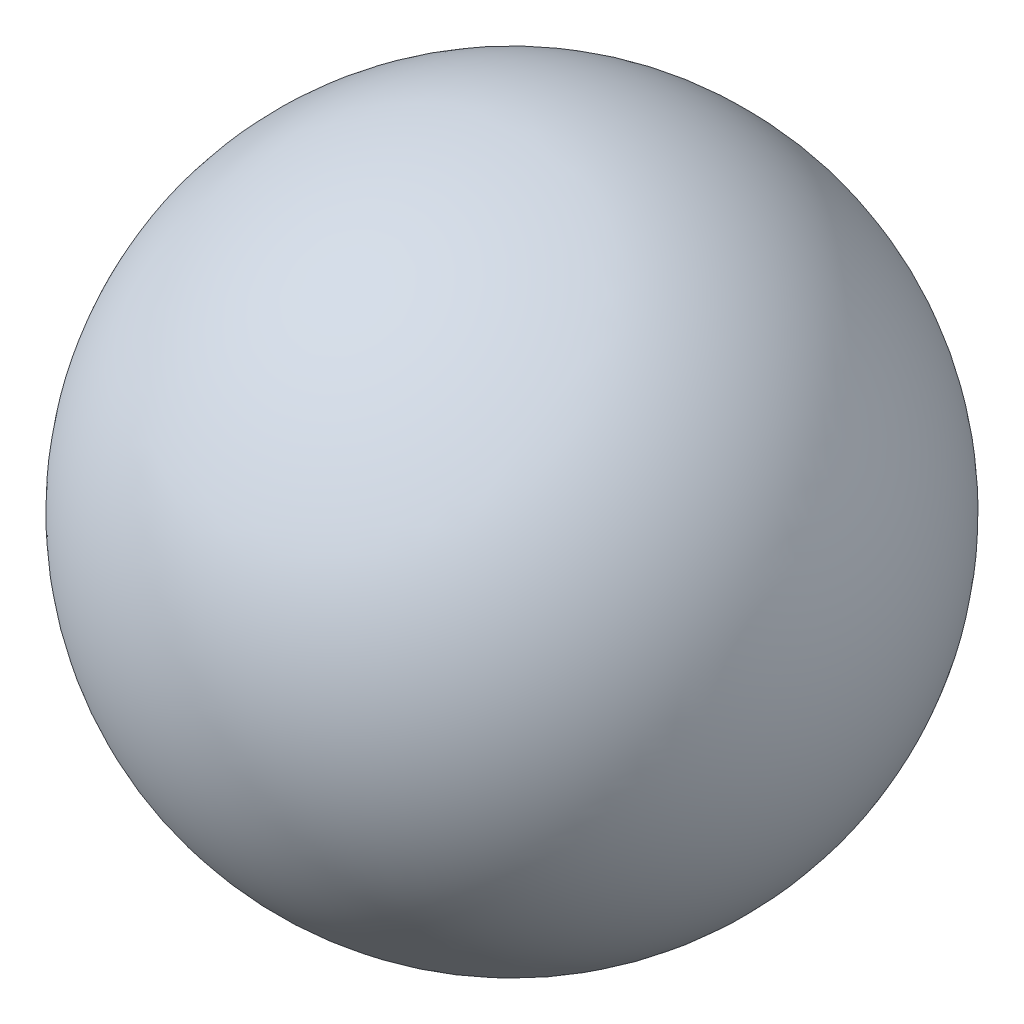
ISO-10303-21;
HEADER;
FILE_DESCRIPTION(('STEP AP214'),'2;1');
FILE_NAME('part.step','',(''),(''),'','','');
FILE_SCHEMA(('AUTOMOTIVE_DESIGN { 1 0 10303 214 1 1 1 1 }'));
ENDSEC;
DATA;
#1=APPLICATION_CONTEXT('core data for automotive mechanical design processes');
#2=APPLICATION_PROTOCOL_DEFINITION('international standard','automotive_design',2000,#1);
#3=PRODUCT_CONTEXT('',#1,'mechanical');
#4=PRODUCT('Part','Part','',(#3));
#5=PRODUCT_RELATED_PRODUCT_CATEGORY('part','',(#4));
#6=PRODUCT_DEFINITION_FORMATION('','',#4);
#7=PRODUCT_DEFINITION_CONTEXT('part definition',#1,'design');
#8=PRODUCT_DEFINITION('design','',#6,#7);
#9=PRODUCT_DEFINITION_SHAPE('','',#8);
#10=(LENGTH_UNIT() NAMED_UNIT(*) SI_UNIT(.MILLI.,.METRE.));
#11=(NAMED_UNIT(*) PLANE_ANGLE_UNIT() SI_UNIT($,.RADIAN.));
#12=(NAMED_UNIT(*) SI_UNIT($,.STERADIAN.) SOLID_ANGLE_UNIT());
#13=UNCERTAINTY_MEASURE_WITH_UNIT(LENGTH_MEASURE(1.E-05),#10,'distance_accuracy_value','');
#14=(GEOMETRIC_REPRESENTATION_CONTEXT(3) GLOBAL_UNCERTAINTY_ASSIGNED_CONTEXT((#13)) GLOBAL_UNIT_ASSIGNED_CONTEXT((#10,
#11,#12)) REPRESENTATION_CONTEXT('',''));
#15=CARTESIAN_POINT('',(0.,0.,0.));
#16=DIRECTION('',(0.,0.,1.));
#17=DIRECTION('',(1.,0.,0.));
#18=AXIS2_PLACEMENT_3D('',#15,#16,#17);
#19=CARTESIAN_POINT('',(5.5,0.,0.));
#20=DIRECTION('',(-1.,0.,0.));
#21=DIRECTION('',(0.,1.,0.));
#22=AXIS2_PLACEMENT_3D('',#19,#20,#21);
#23=SPHERICAL_SURFACE('',#22,5.5);
#24=CARTESIAN_POINT('',(0.,0.,0.));
#25=VERTEX_POINT('',#24);
#26=VERTEX_LOOP('',#25);
#27=FACE_BOUND('',#26,.T.);
#28=ADVANCED_FACE('F39',(#27),#23,.T.);
#29=CLOSED_SHELL('',(#28));
#30=MANIFOLD_SOLID_BREP('B2',#29);
#31=ADVANCED_BREP_SHAPE_REPRESENTATION('',(#18,#30),#14);
#32=SHAPE_DEFINITION_REPRESENTATION(#9,#31);
ENDSEC;
END-ISO-10303-21;
